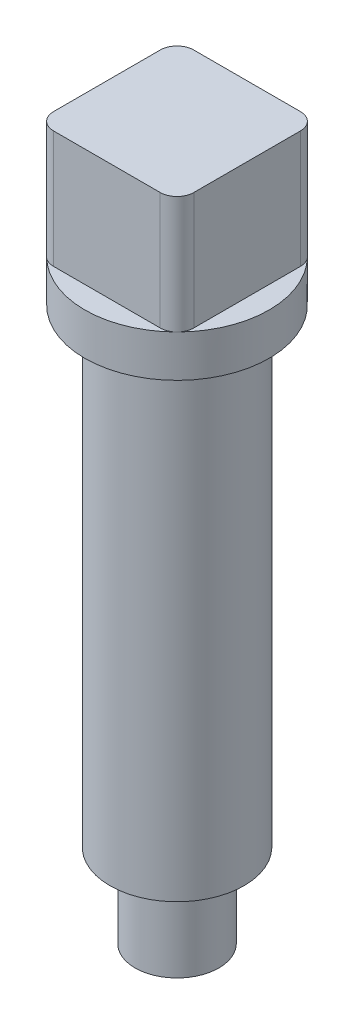
ISO-10303-21;
HEADER;
FILE_DESCRIPTION(('STEP AP214'),'2;1');
FILE_NAME('part.step','',(''),(''),'','','');
FILE_SCHEMA(('AUTOMOTIVE_DESIGN { 1 0 10303 214 1 1 1 1 }'));
ENDSEC;
DATA;
#1=APPLICATION_CONTEXT('core data for automotive mechanical design processes');
#2=APPLICATION_PROTOCOL_DEFINITION('international standard','automotive_design',2000,#1);
#3=PRODUCT_CONTEXT('',#1,'mechanical');
#4=PRODUCT('Part','Part','',(#3));
#5=PRODUCT_RELATED_PRODUCT_CATEGORY('part','',(#4));
#6=PRODUCT_DEFINITION_FORMATION('','',#4);
#7=PRODUCT_DEFINITION_CONTEXT('part definition',#1,'design');
#8=PRODUCT_DEFINITION('design','',#6,#7);
#9=PRODUCT_DEFINITION_SHAPE('','',#8);
#10=(LENGTH_UNIT() NAMED_UNIT(*) SI_UNIT(.MILLI.,.METRE.));
#11=(NAMED_UNIT(*) PLANE_ANGLE_UNIT() SI_UNIT($,.RADIAN.));
#12=(NAMED_UNIT(*) SI_UNIT($,.STERADIAN.) SOLID_ANGLE_UNIT());
#13=UNCERTAINTY_MEASURE_WITH_UNIT(LENGTH_MEASURE(1.E-05),#10,'distance_accuracy_value','');
#14=(GEOMETRIC_REPRESENTATION_CONTEXT(3) GLOBAL_UNCERTAINTY_ASSIGNED_CONTEXT((#13)) GLOBAL_UNIT_ASSIGNED_CONTEXT((#10,
#11,#12)) REPRESENTATION_CONTEXT('',''));
#15=CARTESIAN_POINT('',(0.,0.,0.));
#16=DIRECTION('',(0.,0.,1.));
#17=DIRECTION('',(1.,0.,0.));
#18=AXIS2_PLACEMENT_3D('',#15,#16,#17);
#19=CARTESIAN_POINT('',(11.,71.,0.));
#20=DIRECTION('',(0.,-1.,0.));
#21=DIRECTION('',(0.,0.,-1.));
#22=AXIS2_PLACEMENT_3D('',#19,#20,#21);
#23=PLANE('',#22);
#24=CARTESIAN_POINT('',(6.36396103067893,71.,-6.36396103067893));
#25=DIRECTION('',(0.,1.,0.));
#26=DIRECTION('',(0.,0.,-1.));
#27=AXIS2_PLACEMENT_3D('',#24,#25,#26);
#28=CIRCLE('',#27,2.);
#29=CARTESIAN_POINT('',(8.36396103067893,71.,-6.36396103067893));
#30=VERTEX_POINT('',#29);
#31=CARTESIAN_POINT('',(7.77817459305202,71.,-7.77817459305202));
#32=VERTEX_POINT('',#31);
#33=EDGE_CURVE('E52',#30,#32,#28,.T.);
#34=ORIENTED_EDGE('',*,*,#33,.F.);
#35=DIRECTION('',(0.,0.,-1.));
#36=VECTOR('',#35,1.);
#37=CARTESIAN_POINT('',(8.36396103067893,71.,-6.36396103067893));
#38=LINE('',#37,#36);
#39=CARTESIAN_POINT('',(8.36396103067893,71.,6.36396103067893));
#40=VERTEX_POINT('',#39);
#41=EDGE_CURVE('E62',#40,#30,#38,.T.);
#42=ORIENTED_EDGE('',*,*,#41,.F.);
#43=CARTESIAN_POINT('',(6.36396103067893,71.,6.36396103067893));
#44=DIRECTION('',(0.,1.,0.));
#45=DIRECTION('',(0.,0.,-1.));
#46=AXIS2_PLACEMENT_3D('',#43,#44,#45);
#47=CIRCLE('',#46,2.);
#48=CARTESIAN_POINT('',(7.77817459305202,71.,7.77817459305202));
#49=VERTEX_POINT('',#48);
#50=EDGE_CURVE('E50',#49,#40,#47,.T.);
#51=ORIENTED_EDGE('',*,*,#50,.F.);
#52=CARTESIAN_POINT('',(0.,71.,0.));
#53=DIRECTION('',(0.,1.,0.));
#54=DIRECTION('',(0.,0.,1.));
#55=AXIS2_PLACEMENT_3D('',#52,#53,#54);
#56=CIRCLE('',#55,11.);
#57=EDGE_CURVE('E150',#49,#32,#56,.T.);
#58=ORIENTED_EDGE('',*,*,#57,.T.);
#59=EDGE_LOOP('',(#34,#42,#51,#58));
#60=FACE_BOUND('',#59,.T.);
#61=ADVANCED_FACE('F41',(#60),#23,.F.);
#62=CARTESIAN_POINT('',(6.36396103067893,71.,-8.36396103067893));
#63=VERTEX_POINT('',#62);
#64=EDGE_CURVE('E11',#32,#63,#28,.T.);
#65=ORIENTED_EDGE('',*,*,#64,.F.);
#66=CARTESIAN_POINT('',(-7.77817459305202,71.,-7.77817459305202));
#67=VERTEX_POINT('',#66);
#68=EDGE_CURVE('E156',#32,#67,#56,.T.);
#69=ORIENTED_EDGE('',*,*,#68,.T.);
#70=CARTESIAN_POINT('',(-6.36396103067893,71.,-6.36396103067893));
#71=DIRECTION('',(0.,1.,0.));
#72=DIRECTION('',(0.,0.,1.));
#73=AXIS2_PLACEMENT_3D('',#70,#71,#72);
#74=CIRCLE('',#73,2.);
#75=CARTESIAN_POINT('',(-6.36396103067893,71.,-8.36396103067893));
#76=VERTEX_POINT('',#75);
#77=EDGE_CURVE('E173',#76,#67,#74,.T.);
#78=ORIENTED_EDGE('',*,*,#77,.F.);
#79=DIRECTION('',(-1.,0.,0.));
#80=VECTOR('',#79,1.);
#81=CARTESIAN_POINT('',(6.36396103067893,71.,-8.36396103067893));
#82=LINE('',#81,#80);
#83=EDGE_CURVE('E139',#63,#76,#82,.T.);
#84=ORIENTED_EDGE('',*,*,#83,.F.);
#85=EDGE_LOOP('',(#65,#69,#78,#84));
#86=FACE_BOUND('',#85,.T.);
#87=ADVANCED_FACE('F227',(#86),#23,.F.);
#88=CARTESIAN_POINT('',(6.36396103067893,71.,8.36396103067893));
#89=VERTEX_POINT('',#88);
#90=EDGE_CURVE('E185',#89,#49,#47,.T.);
#91=ORIENTED_EDGE('',*,*,#90,.F.);
#92=DIRECTION('',(1.,0.,0.));
#93=VECTOR('',#92,1.);
#94=CARTESIAN_POINT('',(6.36396103067893,71.,8.36396103067893));
#95=LINE('',#94,#93);
#96=CARTESIAN_POINT('',(-6.36396103067893,71.,8.36396103067893));
#97=VERTEX_POINT('',#96);
#98=EDGE_CURVE('E181',#97,#89,#95,.T.);
#99=ORIENTED_EDGE('',*,*,#98,.F.);
#100=CARTESIAN_POINT('',(-6.36396103067893,71.,6.36396103067893));
#101=DIRECTION('',(0.,1.,0.));
#102=DIRECTION('',(0.,0.,-1.));
#103=AXIS2_PLACEMENT_3D('',#100,#101,#102);
#104=CIRCLE('',#103,2.);
#105=CARTESIAN_POINT('',(-7.77817459305202,71.,7.77817459305202));
#106=VERTEX_POINT('',#105);
#107=EDGE_CURVE('E171',#106,#97,#104,.T.);
#108=ORIENTED_EDGE('',*,*,#107,.F.);
#109=EDGE_CURVE('E145',#106,#49,#56,.T.);
#110=ORIENTED_EDGE('',*,*,#109,.T.);
#111=EDGE_LOOP('',(#91,#99,#108,#110));
#112=FACE_BOUND('',#111,.T.);
#113=ADVANCED_FACE('F215',(#112),#23,.F.);
#114=CARTESIAN_POINT('',(-8.36396103067893,71.,-6.36396103067893));
#115=VERTEX_POINT('',#114);
#116=EDGE_CURVE('E144',#67,#115,#74,.T.);
#117=ORIENTED_EDGE('',*,*,#116,.F.);
#118=EDGE_CURVE('E148',#67,#106,#56,.T.);
#119=ORIENTED_EDGE('',*,*,#118,.T.);
#120=CARTESIAN_POINT('',(-8.36396103067893,71.,6.36396103067893));
#121=VERTEX_POINT('',#120);
#122=EDGE_CURVE('E176',#121,#106,#104,.T.);
#123=ORIENTED_EDGE('',*,*,#122,.F.);
#124=DIRECTION('',(0.,0.,1.));
#125=VECTOR('',#124,1.);
#126=CARTESIAN_POINT('',(-8.36396103067893,71.,-6.36396103067893));
#127=LINE('',#126,#125);
#128=EDGE_CURVE('E179',#115,#121,#127,.T.);
#129=ORIENTED_EDGE('',*,*,#128,.F.);
#130=EDGE_LOOP('',(#117,#119,#123,#129));
#131=FACE_BOUND('',#130,.T.);
#132=ADVANCED_FACE('F225',(#131),#23,.F.);
#133=CARTESIAN_POINT('',(0.,0.,0.));
#134=DIRECTION('',(0.,1.,0.));
#135=DIRECTION('',(0.,0.,1.));
#136=AXIS2_PLACEMENT_3D('',#133,#134,#135);
#137=PLANE('',#136);
#138=CARTESIAN_POINT('',(0.,0.,0.));
#139=DIRECTION('',(0.,1.,0.));
#140=DIRECTION('',(0.,0.,1.));
#141=AXIS2_PLACEMENT_3D('',#138,#139,#140);
#142=CIRCLE('',#141,5.00000000000001);
#143=CARTESIAN_POINT('',(0.,0.,5.00000000000001));
#144=VERTEX_POINT('',#143);
#145=EDGE_CURVE('E45',#144,#144,#142,.T.);
#146=ORIENTED_EDGE('',*,*,#145,.F.);
#147=EDGE_LOOP('',(#146));
#148=FACE_BOUND('',#147,.T.);
#149=ADVANCED_FACE('F43',(#148),#137,.F.);
#150=CARTESIAN_POINT('',(0.,71.,0.));
#151=DIRECTION('',(0.,1.,0.));
#152=DIRECTION('',(0.,0.,1.));
#153=AXIS2_PLACEMENT_3D('',#150,#151,#152);
#154=CYLINDRICAL_SURFACE('',#153,5.00000000000001);
#155=CARTESIAN_POINT('',(0.,9.99999999999999,0.));
#156=DIRECTION('',(0.,1.,0.));
#157=DIRECTION('',(0.,0.,1.));
#158=AXIS2_PLACEMENT_3D('',#155,#156,#157);
#159=CIRCLE('',#158,5.00000000000001);
#160=CARTESIAN_POINT('',(0.,9.99999999999999,5.00000000000001));
#161=VERTEX_POINT('',#160);
#162=EDGE_CURVE('E164',#161,#161,#159,.T.);
#163=ORIENTED_EDGE('',*,*,#162,.F.);
#164=EDGE_LOOP('',(#163));
#165=FACE_BOUND('',#164,.T.);
#166=ORIENTED_EDGE('',*,*,#145,.T.);
#167=EDGE_LOOP('',(#166));
#168=FACE_BOUND('',#167,.T.);
#169=ADVANCED_FACE('F270',(#165,#168),#154,.T.);
#170=CARTESIAN_POINT('',(5.00000000000001,9.99999999999999,0.));
#171=DIRECTION('',(0.,1.,0.));
#172=DIRECTION('',(0.,0.,1.));
#173=AXIS2_PLACEMENT_3D('',#170,#171,#172);
#174=PLANE('',#173);
#175=CARTESIAN_POINT('',(0.,9.99999999999999,0.));
#176=DIRECTION('',(0.,1.,0.));
#177=DIRECTION('',(0.,0.,1.));
#178=AXIS2_PLACEMENT_3D('',#175,#176,#177);
#179=CIRCLE('',#178,8.00000000000001);
#180=CARTESIAN_POINT('',(0.,9.99999999999999,8.00000000000001));
#181=VERTEX_POINT('',#180);
#182=EDGE_CURVE('E162',#181,#181,#179,.T.);
#183=ORIENTED_EDGE('',*,*,#182,.F.);
#184=EDGE_LOOP('',(#183));
#185=FACE_BOUND('',#184,.T.);
#186=ORIENTED_EDGE('',*,*,#162,.T.);
#187=EDGE_LOOP('',(#186));
#188=FACE_BOUND('',#187,.T.);
#189=ADVANCED_FACE('F306',(#185,#188),#174,.F.);
#190=CARTESIAN_POINT('',(0.,71.,0.));
#191=DIRECTION('',(0.,1.,0.));
#192=DIRECTION('',(0.,0.,1.));
#193=AXIS2_PLACEMENT_3D('',#190,#191,#192);
#194=CYLINDRICAL_SURFACE('',#193,8.00000000000001);
#195=CARTESIAN_POINT('',(0.,66.,0.));
#196=DIRECTION('',(0.,1.,0.));
#197=DIRECTION('',(0.,0.,1.));
#198=AXIS2_PLACEMENT_3D('',#195,#196,#197);
#199=CIRCLE('',#198,8.00000000000001);
#200=CARTESIAN_POINT('',(0.,66.,8.00000000000001));
#201=VERTEX_POINT('',#200);
#202=EDGE_CURVE('E159',#201,#201,#199,.T.);
#203=ORIENTED_EDGE('',*,*,#202,.F.);
#204=EDGE_LOOP('',(#203));
#205=FACE_BOUND('',#204,.T.);
#206=ORIENTED_EDGE('',*,*,#182,.T.);
#207=EDGE_LOOP('',(#206));
#208=FACE_BOUND('',#207,.T.);
#209=ADVANCED_FACE('F293',(#205,#208),#194,.T.);
#210=CARTESIAN_POINT('',(8.00000000000001,66.,0.));
#211=DIRECTION('',(0.,1.,0.));
#212=DIRECTION('',(0.,0.,1.));
#213=AXIS2_PLACEMENT_3D('',#210,#211,#212);
#214=PLANE('',#213);
#215=CARTESIAN_POINT('',(0.,66.,0.));
#216=DIRECTION('',(0.,1.,0.));
#217=DIRECTION('',(0.,0.,1.));
#218=AXIS2_PLACEMENT_3D('',#215,#216,#217);
#219=CIRCLE('',#218,11.);
#220=CARTESIAN_POINT('',(0.,66.,11.));
#221=VERTEX_POINT('',#220);
#222=EDGE_CURVE('E155',#221,#221,#219,.T.);
#223=ORIENTED_EDGE('',*,*,#222,.F.);
#224=EDGE_LOOP('',(#223));
#225=FACE_BOUND('',#224,.T.);
#226=ORIENTED_EDGE('',*,*,#202,.T.);
#227=EDGE_LOOP('',(#226));
#228=FACE_BOUND('',#227,.T.);
#229=ADVANCED_FACE('F288',(#225,#228),#214,.F.);
#230=CARTESIAN_POINT('',(0.,71.,0.));
#231=DIRECTION('',(0.,1.,0.));
#232=DIRECTION('',(0.,0.,1.));
#233=AXIS2_PLACEMENT_3D('',#230,#231,#232);
#234=CYLINDRICAL_SURFACE('',#233,11.);
#235=ORIENTED_EDGE('',*,*,#57,.F.);
#236=ORIENTED_EDGE('',*,*,#109,.F.);
#237=ORIENTED_EDGE('',*,*,#118,.F.);
#238=ORIENTED_EDGE('',*,*,#68,.F.);
#239=EDGE_LOOP('',(#235,#236,#237,#238));
#240=FACE_BOUND('',#239,.T.);
#241=ORIENTED_EDGE('',*,*,#222,.T.);
#242=EDGE_LOOP('',(#241));
#243=FACE_BOUND('',#242,.T.);
#244=ADVANCED_FACE('F220',(#240,#243),#234,.T.);
#245=CARTESIAN_POINT('',(-6.36396103067893,85.,-6.36396103067893));
#246=DIRECTION('',(0.,-1.,0.));
#247=DIRECTION('',(0.,0.,-1.));
#248=AXIS2_PLACEMENT_3D('',#245,#246,#247);
#249=CYLINDRICAL_SURFACE('',#248,2.);
#250=ORIENTED_EDGE('',*,*,#77,.T.);
#251=ORIENTED_EDGE('',*,*,#116,.T.);
#252=DIRECTION('',(0.,-1.,0.));
#253=VECTOR('',#252,1.);
#254=CARTESIAN_POINT('',(-8.36396103067893,85.,-6.36396103067893));
#255=LINE('',#254,#253);
#256=CARTESIAN_POINT('',(-8.36396103067893,85.,-6.36396103067893));
#257=VERTEX_POINT('',#256);
#258=EDGE_CURVE('E124',#257,#115,#255,.T.);
#259=ORIENTED_EDGE('',*,*,#258,.F.);
#260=CARTESIAN_POINT('',(-6.36396103067893,85.,-6.36396103067893));
#261=DIRECTION('',(0.,1.,0.));
#262=DIRECTION('',(0.,0.,1.));
#263=AXIS2_PLACEMENT_3D('',#260,#261,#262);
#264=CIRCLE('',#263,2.);
#265=CARTESIAN_POINT('',(-6.36396103067893,85.,-8.36396103067893));
#266=VERTEX_POINT('',#265);
#267=EDGE_CURVE('E130',#266,#257,#264,.T.);
#268=ORIENTED_EDGE('',*,*,#267,.F.);
#269=DIRECTION('',(0.,-1.,0.));
#270=VECTOR('',#269,1.);
#271=CARTESIAN_POINT('',(-6.36396103067893,85.,-8.36396103067893));
#272=LINE('',#271,#270);
#273=EDGE_CURVE('E191',#266,#76,#272,.T.);
#274=ORIENTED_EDGE('',*,*,#273,.T.);
#275=EDGE_LOOP('',(#250,#251,#259,#268,#274));
#276=FACE_BOUND('',#275,.T.);
#277=ADVANCED_FACE('F143',(#276),#249,.T.);
#278=CARTESIAN_POINT('',(-8.36396103067893,85.,-6.36396103067893));
#279=DIRECTION('',(1.,0.,0.));
#280=DIRECTION('',(0.,0.,-1.));
#281=AXIS2_PLACEMENT_3D('',#278,#279,#280);
#282=PLANE('',#281);
#283=ORIENTED_EDGE('',*,*,#128,.T.);
#284=DIRECTION('',(0.,-1.,0.));
#285=VECTOR('',#284,1.);
#286=CARTESIAN_POINT('',(-8.36396103067893,85.,6.36396103067893));
#287=LINE('',#286,#285);
#288=CARTESIAN_POINT('',(-8.36396103067893,85.,6.36396103067893));
#289=VERTEX_POINT('',#288);
#290=EDGE_CURVE('E126',#289,#121,#287,.T.);
#291=ORIENTED_EDGE('',*,*,#290,.F.);
#292=DIRECTION('',(0.,0.,1.));
#293=VECTOR('',#292,1.);
#294=CARTESIAN_POINT('',(-8.36396103067893,85.,-6.36396103067893));
#295=LINE('',#294,#293);
#296=EDGE_CURVE('E119',#257,#289,#295,.T.);
#297=ORIENTED_EDGE('',*,*,#296,.F.);
#298=ORIENTED_EDGE('',*,*,#258,.T.);
#299=EDGE_LOOP('',(#283,#291,#297,#298));
#300=FACE_BOUND('',#299,.T.);
#301=ADVANCED_FACE('F122',(#300),#282,.F.);
#302=CARTESIAN_POINT('',(-6.36396103067893,85.,6.36396103067893));
#303=DIRECTION('',(0.,-1.,0.));
#304=DIRECTION('',(0.,0.,-1.));
#305=AXIS2_PLACEMENT_3D('',#302,#303,#304);
#306=CYLINDRICAL_SURFACE('',#305,2.);
#307=ORIENTED_EDGE('',*,*,#122,.T.);
#308=ORIENTED_EDGE('',*,*,#107,.T.);
#309=DIRECTION('',(0.,-1.,0.));
#310=VECTOR('',#309,1.);
#311=CARTESIAN_POINT('',(-6.36396103067893,85.,8.36396103067893));
#312=LINE('',#311,#310);
#313=CARTESIAN_POINT('',(-6.36396103067893,85.,8.36396103067893));
#314=VERTEX_POINT('',#313);
#315=EDGE_CURVE('E151',#314,#97,#312,.T.);
#316=ORIENTED_EDGE('',*,*,#315,.F.);
#317=CARTESIAN_POINT('',(-6.36396103067893,85.,6.36396103067893));
#318=DIRECTION('',(0.,1.,0.));
#319=DIRECTION('',(0.,0.,-1.));
#320=AXIS2_PLACEMENT_3D('',#317,#318,#319);
#321=CIRCLE('',#320,2.);
#322=EDGE_CURVE('E129',#289,#314,#321,.T.);
#323=ORIENTED_EDGE('',*,*,#322,.F.);
#324=ORIENTED_EDGE('',*,*,#290,.T.);
#325=EDGE_LOOP('',(#307,#308,#316,#323,#324));
#326=FACE_BOUND('',#325,.T.);
#327=ADVANCED_FACE('F212',(#326),#306,.T.);
#328=CARTESIAN_POINT('',(6.36396103067893,85.,8.36396103067893));
#329=DIRECTION('',(0.,0.,-1.));
#330=DIRECTION('',(-1.,0.,0.));
#331=AXIS2_PLACEMENT_3D('',#328,#329,#330);
#332=PLANE('',#331);
#333=ORIENTED_EDGE('',*,*,#98,.T.);
#334=DIRECTION('',(0.,-1.,0.));
#335=VECTOR('',#334,1.);
#336=CARTESIAN_POINT('',(6.36396103067893,85.,8.36396103067893));
#337=LINE('',#336,#335);
#338=CARTESIAN_POINT('',(6.36396103067893,85.,8.36396103067893));
#339=VERTEX_POINT('',#338);
#340=EDGE_CURVE('E202',#339,#89,#337,.T.);
#341=ORIENTED_EDGE('',*,*,#340,.F.);
#342=DIRECTION('',(1.,0.,0.));
#343=VECTOR('',#342,1.);
#344=CARTESIAN_POINT('',(6.36396103067893,85.,8.36396103067893));
#345=LINE('',#344,#343);
#346=EDGE_CURVE('E210',#314,#339,#345,.T.);
#347=ORIENTED_EDGE('',*,*,#346,.F.);
#348=ORIENTED_EDGE('',*,*,#315,.T.);
#349=EDGE_LOOP('',(#333,#341,#347,#348));
#350=FACE_BOUND('',#349,.T.);
#351=ADVANCED_FACE('F208',(#350),#332,.F.);
#352=CARTESIAN_POINT('',(6.36396103067893,85.,6.36396103067893));
#353=DIRECTION('',(0.,-1.,0.));
#354=DIRECTION('',(0.,0.,-1.));
#355=AXIS2_PLACEMENT_3D('',#352,#353,#354);
#356=CYLINDRICAL_SURFACE('',#355,2.);
#357=ORIENTED_EDGE('',*,*,#90,.T.);
#358=ORIENTED_EDGE('',*,*,#50,.T.);
#359=DIRECTION('',(0.,-1.,0.));
#360=VECTOR('',#359,1.);
#361=CARTESIAN_POINT('',(8.36396103067893,85.,6.36396103067893));
#362=LINE('',#361,#360);
#363=CARTESIAN_POINT('',(8.36396103067893,85.,6.36396103067893));
#364=VERTEX_POINT('',#363);
#365=EDGE_CURVE('E199',#364,#40,#362,.T.);
#366=ORIENTED_EDGE('',*,*,#365,.F.);
#367=CARTESIAN_POINT('',(6.36396103067893,85.,6.36396103067893));
#368=DIRECTION('',(0.,1.,0.));
#369=DIRECTION('',(0.,0.,-1.));
#370=AXIS2_PLACEMENT_3D('',#367,#368,#369);
#371=CIRCLE('',#370,2.);
#372=EDGE_CURVE('E242',#339,#364,#371,.T.);
#373=ORIENTED_EDGE('',*,*,#372,.F.);
#374=ORIENTED_EDGE('',*,*,#340,.T.);
#375=EDGE_LOOP('',(#357,#358,#366,#373,#374));
#376=FACE_BOUND('',#375,.T.);
#377=ADVANCED_FACE('F241',(#376),#356,.T.);
#378=CARTESIAN_POINT('',(8.36396103067893,85.,-6.36396103067893));
#379=DIRECTION('',(-1.,0.,0.));
#380=DIRECTION('',(0.,0.,1.));
#381=AXIS2_PLACEMENT_3D('',#378,#379,#380);
#382=PLANE('',#381);
#383=ORIENTED_EDGE('',*,*,#41,.T.);
#384=DIRECTION('',(0.,-1.,0.));
#385=VECTOR('',#384,1.);
#386=CARTESIAN_POINT('',(8.36396103067893,85.,-6.36396103067893));
#387=LINE('',#386,#385);
#388=CARTESIAN_POINT('',(8.36396103067893,85.,-6.36396103067893));
#389=VERTEX_POINT('',#388);
#390=EDGE_CURVE('E196',#389,#30,#387,.T.);
#391=ORIENTED_EDGE('',*,*,#390,.F.);
#392=DIRECTION('',(0.,0.,-1.));
#393=VECTOR('',#392,1.);
#394=CARTESIAN_POINT('',(8.36396103067893,85.,-6.36396103067893));
#395=LINE('',#394,#393);
#396=EDGE_CURVE('E237',#364,#389,#395,.T.);
#397=ORIENTED_EDGE('',*,*,#396,.F.);
#398=ORIENTED_EDGE('',*,*,#365,.T.);
#399=EDGE_LOOP('',(#383,#391,#397,#398));
#400=FACE_BOUND('',#399,.T.);
#401=ADVANCED_FACE('F236',(#400),#382,.F.);
#402=CARTESIAN_POINT('',(6.36396103067893,85.,-6.36396103067893));
#403=DIRECTION('',(0.,-1.,0.));
#404=DIRECTION('',(0.,0.,-1.));
#405=AXIS2_PLACEMENT_3D('',#402,#403,#404);
#406=CYLINDRICAL_SURFACE('',#405,2.);
#407=ORIENTED_EDGE('',*,*,#33,.T.);
#408=ORIENTED_EDGE('',*,*,#64,.T.);
#409=DIRECTION('',(0.,-1.,0.));
#410=VECTOR('',#409,1.);
#411=CARTESIAN_POINT('',(6.36396103067893,85.,-8.36396103067893));
#412=LINE('',#411,#410);
#413=CARTESIAN_POINT('',(6.36396103067893,85.,-8.36396103067893));
#414=VERTEX_POINT('',#413);
#415=EDGE_CURVE('E193',#414,#63,#412,.T.);
#416=ORIENTED_EDGE('',*,*,#415,.F.);
#417=CARTESIAN_POINT('',(6.36396103067893,85.,-6.36396103067893));
#418=DIRECTION('',(0.,1.,0.));
#419=DIRECTION('',(0.,0.,-1.));
#420=AXIS2_PLACEMENT_3D('',#417,#418,#419);
#421=CIRCLE('',#420,2.);
#422=EDGE_CURVE('E233',#389,#414,#421,.T.);
#423=ORIENTED_EDGE('',*,*,#422,.F.);
#424=ORIENTED_EDGE('',*,*,#390,.T.);
#425=EDGE_LOOP('',(#407,#408,#416,#423,#424));
#426=FACE_BOUND('',#425,.T.);
#427=ADVANCED_FACE('F229',(#426),#406,.T.);
#428=CARTESIAN_POINT('',(6.36396103067893,85.,-8.36396103067893));
#429=DIRECTION('',(0.,0.,1.));
#430=DIRECTION('',(1.,0.,0.));
#431=AXIS2_PLACEMENT_3D('',#428,#429,#430);
#432=PLANE('',#431);
#433=ORIENTED_EDGE('',*,*,#83,.T.);
#434=ORIENTED_EDGE('',*,*,#273,.F.);
#435=DIRECTION('',(-1.,0.,0.));
#436=VECTOR('',#435,1.);
#437=CARTESIAN_POINT('',(6.36396103067893,85.,-8.36396103067893));
#438=LINE('',#437,#436);
#439=EDGE_CURVE('E135',#414,#266,#438,.T.);
#440=ORIENTED_EDGE('',*,*,#439,.F.);
#441=ORIENTED_EDGE('',*,*,#415,.T.);
#442=EDGE_LOOP('',(#433,#434,#440,#441));
#443=FACE_BOUND('',#442,.T.);
#444=ADVANCED_FACE('F249',(#443),#432,.F.);
#445=CARTESIAN_POINT('',(-6.36396103067893,85.,-6.36396103067893));
#446=DIRECTION('',(0.,1.,0.));
#447=DIRECTION('',(0.,0.,1.));
#448=AXIS2_PLACEMENT_3D('',#445,#446,#447);
#449=PLANE('',#448);
#450=ORIENTED_EDGE('',*,*,#267,.T.);
#451=ORIENTED_EDGE('',*,*,#296,.T.);
#452=ORIENTED_EDGE('',*,*,#322,.T.);
#453=ORIENTED_EDGE('',*,*,#346,.T.);
#454=ORIENTED_EDGE('',*,*,#372,.T.);
#455=ORIENTED_EDGE('',*,*,#396,.T.);
#456=ORIENTED_EDGE('',*,*,#422,.T.);
#457=ORIENTED_EDGE('',*,*,#439,.T.);
#458=EDGE_LOOP('',(#450,#451,#452,#453,#454,#455,#456,#457));
#459=FACE_BOUND('',#458,.T.);
#460=ADVANCED_FACE('F133',(#459),#449,.T.);
#461=CLOSED_SHELL('',(#61,#87,#113,#132,#149,#169,#189,#209,#229,#244,#277,#301,#327,#351,#377,
#401,#427,#444,#460));
#462=MANIFOLD_SOLID_BREP('B2',#461);
#463=ADVANCED_BREP_SHAPE_REPRESENTATION('',(#18,#462),#14);
#464=SHAPE_DEFINITION_REPRESENTATION(#9,#463);
ENDSEC;
END-ISO-10303-21;
